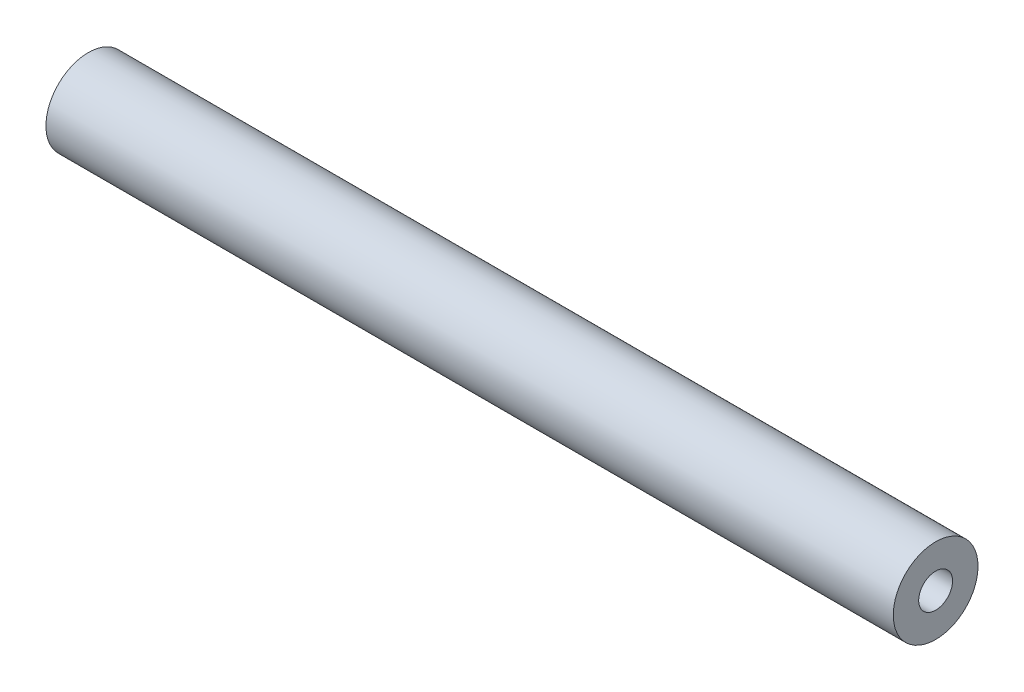
ISO-10303-21;
HEADER;
FILE_DESCRIPTION(('STEP AP214'),'2;1');
FILE_NAME('part.step','',(''),(''),'','','');
FILE_SCHEMA(('AUTOMOTIVE_DESIGN { 1 0 10303 214 1 1 1 1 }'));
ENDSEC;
DATA;
#1=APPLICATION_CONTEXT('core data for automotive mechanical design processes');
#2=APPLICATION_PROTOCOL_DEFINITION('international standard','automotive_design',2000,#1);
#3=PRODUCT_CONTEXT('',#1,'mechanical');
#4=PRODUCT('Part','Part','',(#3));
#5=PRODUCT_RELATED_PRODUCT_CATEGORY('part','',(#4));
#6=PRODUCT_DEFINITION_FORMATION('','',#4);
#7=PRODUCT_DEFINITION_CONTEXT('part definition',#1,'design');
#8=PRODUCT_DEFINITION('design','',#6,#7);
#9=PRODUCT_DEFINITION_SHAPE('','',#8);
#10=(LENGTH_UNIT() NAMED_UNIT(*) SI_UNIT(.MILLI.,.METRE.));
#11=(NAMED_UNIT(*) PLANE_ANGLE_UNIT() SI_UNIT($,.RADIAN.));
#12=(NAMED_UNIT(*) SI_UNIT($,.STERADIAN.) SOLID_ANGLE_UNIT());
#13=UNCERTAINTY_MEASURE_WITH_UNIT(LENGTH_MEASURE(1.E-05),#10,'distance_accuracy_value','');
#14=(GEOMETRIC_REPRESENTATION_CONTEXT(3) GLOBAL_UNCERTAINTY_ASSIGNED_CONTEXT((#13)) GLOBAL_UNIT_ASSIGNED_CONTEXT((#10,
#11,#12)) REPRESENTATION_CONTEXT('',''));
#15=CARTESIAN_POINT('',(0.,0.,0.));
#16=DIRECTION('',(0.,0.,1.));
#17=DIRECTION('',(1.,0.,0.));
#18=AXIS2_PLACEMENT_3D('',#15,#16,#17);
#19=CARTESIAN_POINT('',(50.,0.,0.));
#20=DIRECTION('',(1.,0.,0.));
#21=DIRECTION('',(0.,0.,-1.));
#22=AXIS2_PLACEMENT_3D('',#19,#20,#21);
#23=PLANE('',#22);
#24=CARTESIAN_POINT('',(50.,0.,0.));
#25=DIRECTION('',(1.,0.,0.));
#26=DIRECTION('',(0.,0.,-1.));
#27=AXIS2_PLACEMENT_3D('',#24,#25,#26);
#28=CIRCLE('',#27,5.);
#29=CARTESIAN_POINT('',(50.,0.,-5.));
#30=VERTEX_POINT('',#29);
#31=EDGE_CURVE('E10',#30,#30,#28,.T.);
#32=ORIENTED_EDGE('',*,*,#31,.T.);
#33=EDGE_LOOP('',(#32));
#34=FACE_BOUND('',#33,.T.);
#35=CARTESIAN_POINT('',(50.,0.,0.));
#36=DIRECTION('',(1.,0.,0.));
#37=DIRECTION('',(0.,0.,-1.));
#38=AXIS2_PLACEMENT_3D('',#35,#36,#37);
#39=CIRCLE('',#38,2.);
#40=CARTESIAN_POINT('',(50.,0.,-2.));
#41=VERTEX_POINT('',#40);
#42=EDGE_CURVE('E44',#41,#41,#39,.T.);
#43=ORIENTED_EDGE('',*,*,#42,.F.);
#44=EDGE_LOOP('',(#43));
#45=FACE_BOUND('',#44,.T.);
#46=ADVANCED_FACE('F33',(#34,#45),#23,.T.);
#47=CARTESIAN_POINT('',(-50.,0.,0.));
#48=DIRECTION('',(1.,0.,0.));
#49=DIRECTION('',(0.,0.,-1.));
#50=AXIS2_PLACEMENT_3D('',#47,#48,#49);
#51=PLANE('',#50);
#52=CARTESIAN_POINT('',(-50.,0.,0.));
#53=DIRECTION('',(1.,0.,0.));
#54=DIRECTION('',(0.,0.,-1.));
#55=AXIS2_PLACEMENT_3D('',#52,#53,#54);
#56=CIRCLE('',#55,5.);
#57=CARTESIAN_POINT('',(-50.,0.,-5.));
#58=VERTEX_POINT('',#57);
#59=EDGE_CURVE('E37',#58,#58,#56,.T.);
#60=ORIENTED_EDGE('',*,*,#59,.F.);
#61=EDGE_LOOP('',(#60));
#62=FACE_BOUND('',#61,.T.);
#63=CARTESIAN_POINT('',(-50.,0.,0.));
#64=DIRECTION('',(1.,0.,0.));
#65=DIRECTION('',(0.,0.,-1.));
#66=AXIS2_PLACEMENT_3D('',#63,#64,#65);
#67=CIRCLE('',#66,2.);
#68=CARTESIAN_POINT('',(-50.,0.,-2.));
#69=VERTEX_POINT('',#68);
#70=EDGE_CURVE('E46',#69,#69,#67,.T.);
#71=ORIENTED_EDGE('',*,*,#70,.T.);
#72=EDGE_LOOP('',(#71));
#73=FACE_BOUND('',#72,.T.);
#74=ADVANCED_FACE('F56',(#62,#73),#51,.F.);
#75=CARTESIAN_POINT('',(50.,0.,0.));
#76=DIRECTION('',(-1.,0.,0.));
#77=DIRECTION('',(0.,0.,1.));
#78=AXIS2_PLACEMENT_3D('',#75,#76,#77);
#79=CYLINDRICAL_SURFACE('',#78,5.);
#80=ORIENTED_EDGE('',*,*,#31,.F.);
#81=EDGE_LOOP('',(#80));
#82=FACE_BOUND('',#81,.T.);
#83=ORIENTED_EDGE('',*,*,#59,.T.);
#84=EDGE_LOOP('',(#83));
#85=FACE_BOUND('',#84,.T.);
#86=ADVANCED_FACE('F35',(#82,#85),#79,.T.);
#87=CARTESIAN_POINT('',(50.,0.,0.));
#88=DIRECTION('',(-1.,0.,0.));
#89=DIRECTION('',(0.,0.,1.));
#90=AXIS2_PLACEMENT_3D('',#87,#88,#89);
#91=CYLINDRICAL_SURFACE('',#90,2.);
#92=ORIENTED_EDGE('',*,*,#42,.T.);
#93=EDGE_LOOP('',(#92));
#94=FACE_BOUND('',#93,.T.);
#95=ORIENTED_EDGE('',*,*,#70,.F.);
#96=EDGE_LOOP('',(#95));
#97=FACE_BOUND('',#96,.T.);
#98=ADVANCED_FACE('F52',(#94,#97),#91,.F.);
#99=CLOSED_SHELL('',(#46,#74,#86,#98));
#100=MANIFOLD_SOLID_BREP('B2',#99);
#101=ADVANCED_BREP_SHAPE_REPRESENTATION('',(#18,#100),#14);
#102=SHAPE_DEFINITION_REPRESENTATION(#9,#101);
ENDSEC;
END-ISO-10303-21;
